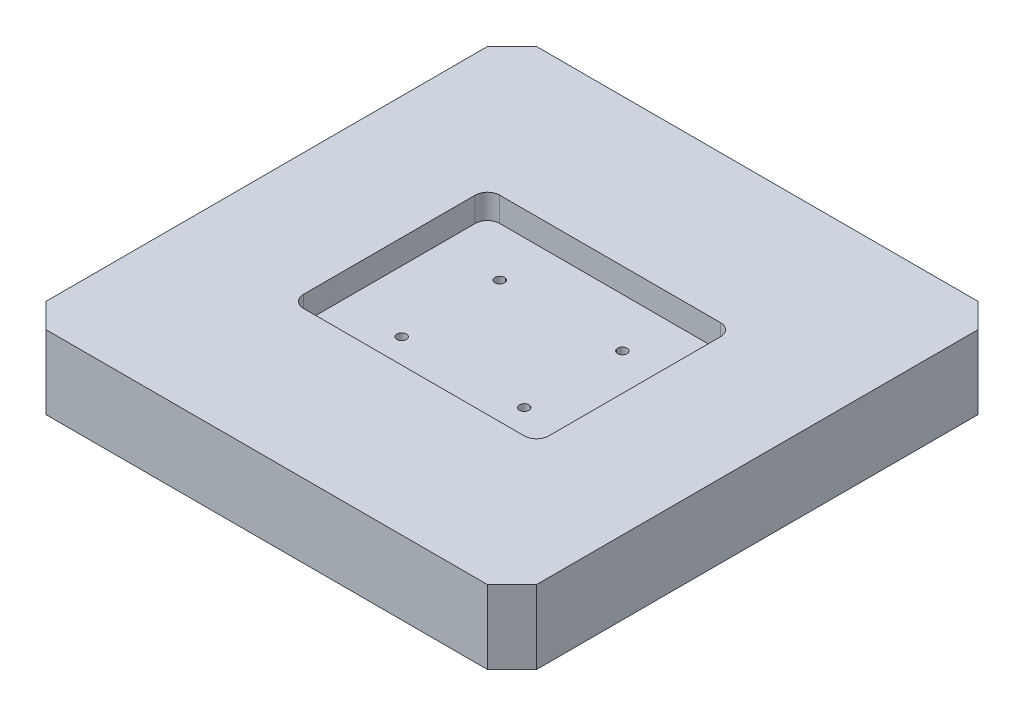
ISO-10303-21;
HEADER;
FILE_DESCRIPTION(('STEP AP214'),'2;1');
FILE_NAME('part.step','',(''),(''),'','','');
FILE_SCHEMA(('AUTOMOTIVE_DESIGN { 1 0 10303 214 1 1 1 1 }'));
ENDSEC;
DATA;
#1=APPLICATION_CONTEXT('core data for automotive mechanical design processes');
#2=APPLICATION_PROTOCOL_DEFINITION('international standard','automotive_design',2000,#1);
#3=PRODUCT_CONTEXT('',#1,'mechanical');
#4=PRODUCT('Part','Part','',(#3));
#5=PRODUCT_RELATED_PRODUCT_CATEGORY('part','',(#4));
#6=PRODUCT_DEFINITION_FORMATION('','',#4);
#7=PRODUCT_DEFINITION_CONTEXT('part definition',#1,'design');
#8=PRODUCT_DEFINITION('design','',#6,#7);
#9=PRODUCT_DEFINITION_SHAPE('','',#8);
#10=(LENGTH_UNIT() NAMED_UNIT(*) SI_UNIT(.MILLI.,.METRE.));
#11=(NAMED_UNIT(*) PLANE_ANGLE_UNIT() SI_UNIT($,.RADIAN.));
#12=(NAMED_UNIT(*) SI_UNIT($,.STERADIAN.) SOLID_ANGLE_UNIT());
#13=UNCERTAINTY_MEASURE_WITH_UNIT(LENGTH_MEASURE(1.E-05),#10,'distance_accuracy_value','');
#14=(GEOMETRIC_REPRESENTATION_CONTEXT(3) GLOBAL_UNCERTAINTY_ASSIGNED_CONTEXT((#13)) GLOBAL_UNIT_ASSIGNED_CONTEXT((#10,
#11,#12)) REPRESENTATION_CONTEXT('',''));
#15=CARTESIAN_POINT('',(0.,0.,0.));
#16=DIRECTION('',(0.,0.,1.));
#17=DIRECTION('',(1.,0.,0.));
#18=AXIS2_PLACEMENT_3D('',#15,#16,#17);
#19=CARTESIAN_POINT('',(0.,38.1,0.));
#20=DIRECTION('',(0.,1.,0.));
#21=DIRECTION('',(0.,0.,1.));
#22=AXIS2_PLACEMENT_3D('',#19,#20,#21);
#23=PLANE('',#22);
#24=DIRECTION('',(0.,0.,-1.));
#25=VECTOR('',#24,1.);
#26=CARTESIAN_POINT('',(254.,38.1,0.));
#27=LINE('',#26,#25);
#28=CARTESIAN_POINT('',(254.,38.1,-12.6999999999999));
#29=VERTEX_POINT('',#28);
#30=CARTESIAN_POINT('',(254.,38.1,-241.3));
#31=VERTEX_POINT('',#30);
#32=EDGE_CURVE('E202',#29,#31,#27,.T.);
#33=ORIENTED_EDGE('',*,*,#32,.T.);
#34=DIRECTION('',(-0.707106781186546,0.,-0.707106781186549));
#35=VECTOR('',#34,1.);
#36=CARTESIAN_POINT('',(247.650000000001,38.1,-247.649999999999));
#37=LINE('',#36,#35);
#38=CARTESIAN_POINT('',(241.3,38.1,-254.));
#39=VERTEX_POINT('',#38);
#40=EDGE_CURVE('E254',#31,#39,#37,.T.);
#41=ORIENTED_EDGE('',*,*,#40,.T.);
#42=DIRECTION('',(1.,0.,0.));
#43=VECTOR('',#42,1.);
#44=CARTESIAN_POINT('',(0.,38.1,-254.));
#45=LINE('',#44,#43);
#46=CARTESIAN_POINT('',(12.7000000000001,38.1,-254.));
#47=VERTEX_POINT('',#46);
#48=EDGE_CURVE('E199',#47,#39,#45,.T.);
#49=ORIENTED_EDGE('',*,*,#48,.F.);
#50=DIRECTION('',(0.707106781186549,0.,-0.707106781186546));
#51=VECTOR('',#50,1.);
#52=CARTESIAN_POINT('',(-120.65,38.1,-120.65));
#53=LINE('',#52,#51);
#54=CARTESIAN_POINT('',(0.,38.1,-241.3));
#55=VERTEX_POINT('',#54);
#56=EDGE_CURVE('E249',#47,#55,#53,.F.);
#57=ORIENTED_EDGE('',*,*,#56,.T.);
#58=DIRECTION('',(0.,0.,-1.));
#59=VECTOR('',#58,1.);
#60=CARTESIAN_POINT('',(0.,38.1,0.));
#61=LINE('',#60,#59);
#62=CARTESIAN_POINT('',(0.,38.1,-12.6999999999999));
#63=VERTEX_POINT('',#62);
#64=EDGE_CURVE('E208',#63,#55,#61,.T.);
#65=ORIENTED_EDGE('',*,*,#64,.F.);
#66=DIRECTION('',(0.707106781186548,0.,0.707106781186548));
#67=VECTOR('',#66,1.);
#68=CARTESIAN_POINT('',(6.34999999999996,38.1,-6.34999999999996));
#69=LINE('',#68,#67);
#70=CARTESIAN_POINT('',(12.6999999999999,38.1,0.));
#71=VERTEX_POINT('',#70);
#72=EDGE_CURVE('E73',#63,#71,#69,.T.);
#73=ORIENTED_EDGE('',*,*,#72,.T.);
#74=DIRECTION('',(1.,0.,0.));
#75=VECTOR('',#74,1.);
#76=CARTESIAN_POINT('',(0.,38.1,0.));
#77=LINE('',#76,#75);
#78=CARTESIAN_POINT('',(241.3,38.1,0.));
#79=VERTEX_POINT('',#78);
#80=EDGE_CURVE('E206',#71,#79,#77,.T.);
#81=ORIENTED_EDGE('',*,*,#80,.T.);
#82=DIRECTION('',(-0.707106781186548,0.,0.707106781186547));
#83=VECTOR('',#82,1.);
#84=CARTESIAN_POINT('',(120.65,38.1,120.65));
#85=LINE('',#84,#83);
#86=EDGE_CURVE('E252',#79,#29,#85,.F.);
#87=ORIENTED_EDGE('',*,*,#86,.T.);
#88=EDGE_LOOP('',(#33,#41,#49,#57,#65,#73,#81,#87));
#89=FACE_BOUND('',#88,.T.);
#90=DIRECTION('',(1.,0.,0.));
#91=VECTOR('',#90,1.);
#92=CARTESIAN_POINT('',(69.85,38.1,-76.2));
#93=LINE('',#92,#91);
#94=CARTESIAN_POINT('',(69.85,38.1,-76.2));
#95=VERTEX_POINT('',#94);
#96=CARTESIAN_POINT('',(184.15,38.1,-76.2));
#97=VERTEX_POINT('',#96);
#98=EDGE_CURVE('E184',#95,#97,#93,.T.);
#99=ORIENTED_EDGE('',*,*,#98,.F.);
#100=CARTESIAN_POINT('',(69.85,38.1,-82.55));
#101=DIRECTION('',(0.,-1.,0.));
#102=DIRECTION('',(0.,0.,-1.));
#103=AXIS2_PLACEMENT_3D('',#100,#101,#102);
#104=CIRCLE('',#103,6.34999999999999);
#105=CARTESIAN_POINT('',(63.5,38.1,-82.55));
#106=VERTEX_POINT('',#105);
#107=EDGE_CURVE('E231',#95,#106,#104,.T.);
#108=ORIENTED_EDGE('',*,*,#107,.T.);
#109=DIRECTION('',(0.,0.,-1.));
#110=VECTOR('',#109,1.);
#111=CARTESIAN_POINT('',(63.5,38.1,-82.55));
#112=LINE('',#111,#110);
#113=CARTESIAN_POINT('',(63.5,38.1,-171.45));
#114=VERTEX_POINT('',#113);
#115=EDGE_CURVE('E188',#106,#114,#112,.T.);
#116=ORIENTED_EDGE('',*,*,#115,.T.);
#117=CARTESIAN_POINT('',(69.85,38.1,-171.45));
#118=DIRECTION('',(0.,-1.,0.));
#119=DIRECTION('',(0.,0.,-1.));
#120=AXIS2_PLACEMENT_3D('',#117,#118,#119);
#121=CIRCLE('',#120,6.34999999999999);
#122=CARTESIAN_POINT('',(69.85,38.1,-177.8));
#123=VERTEX_POINT('',#122);
#124=EDGE_CURVE('E499',#114,#123,#121,.T.);
#125=ORIENTED_EDGE('',*,*,#124,.T.);
#126=DIRECTION('',(1.,0.,0.));
#127=VECTOR('',#126,1.);
#128=CARTESIAN_POINT('',(69.85,38.1,-177.8));
#129=LINE('',#128,#127);
#130=CARTESIAN_POINT('',(184.15,38.1,-177.8));
#131=VERTEX_POINT('',#130);
#132=EDGE_CURVE('E503',#123,#131,#129,.T.);
#133=ORIENTED_EDGE('',*,*,#132,.T.);
#134=CARTESIAN_POINT('',(184.15,38.1,-171.45));
#135=DIRECTION('',(0.,-1.,0.));
#136=DIRECTION('',(0.,0.,-1.));
#137=AXIS2_PLACEMENT_3D('',#134,#135,#136);
#138=CIRCLE('',#137,6.34999999999999);
#139=CARTESIAN_POINT('',(190.5,38.1,-171.45));
#140=VERTEX_POINT('',#139);
#141=EDGE_CURVE('E511',#131,#140,#138,.T.);
#142=ORIENTED_EDGE('',*,*,#141,.T.);
#143=DIRECTION('',(0.,0.,-1.));
#144=VECTOR('',#143,1.);
#145=CARTESIAN_POINT('',(190.5,38.1,-82.55));
#146=LINE('',#145,#144);
#147=CARTESIAN_POINT('',(190.5,38.1,-82.55));
#148=VERTEX_POINT('',#147);
#149=EDGE_CURVE('E514',#148,#140,#146,.T.);
#150=ORIENTED_EDGE('',*,*,#149,.F.);
#151=CARTESIAN_POINT('',(184.15,38.1,-82.55));
#152=DIRECTION('',(0.,1.,0.));
#153=DIRECTION('',(0.,0.,1.));
#154=AXIS2_PLACEMENT_3D('',#151,#152,#153);
#155=CIRCLE('',#154,6.34999999999999);
#156=EDGE_CURVE('E517',#97,#148,#155,.T.);
#157=ORIENTED_EDGE('',*,*,#156,.F.);
#158=EDGE_LOOP('',(#99,#108,#116,#125,#133,#142,#150,#157));
#159=FACE_BOUND('',#158,.T.);
#160=ADVANCED_FACE('F51',(#89,#159),#23,.T.);
#161=CARTESIAN_POINT('',(0.,38.1,-254.));
#162=DIRECTION('',(0.,0.,-1.));
#163=DIRECTION('',(-1.,0.,0.));
#164=AXIS2_PLACEMENT_3D('',#161,#162,#163);
#165=PLANE('',#164);
#166=ORIENTED_EDGE('',*,*,#48,.T.);
#167=DIRECTION('',(0.,-1.,0.));
#168=VECTOR('',#167,1.);
#169=CARTESIAN_POINT('',(241.3,0.,-254.));
#170=LINE('',#169,#168);
#171=CARTESIAN_POINT('',(241.3,0.,-254.));
#172=VERTEX_POINT('',#171);
#173=EDGE_CURVE('E233',#39,#172,#170,.T.);
#174=ORIENTED_EDGE('',*,*,#173,.T.);
#175=DIRECTION('',(1.,0.,0.));
#176=VECTOR('',#175,1.);
#177=CARTESIAN_POINT('',(0.,0.,-254.));
#178=LINE('',#177,#176);
#179=CARTESIAN_POINT('',(12.7000000000001,0.,-254.));
#180=VERTEX_POINT('',#179);
#181=EDGE_CURVE('E189',#180,#172,#178,.T.);
#182=ORIENTED_EDGE('',*,*,#181,.F.);
#183=DIRECTION('',(0.,1.,0.));
#184=VECTOR('',#183,1.);
#185=CARTESIAN_POINT('',(12.7000000000001,38.1,-254.));
#186=LINE('',#185,#184);
#187=EDGE_CURVE('E210',#180,#47,#186,.T.);
#188=ORIENTED_EDGE('',*,*,#187,.T.);
#189=EDGE_LOOP('',(#166,#174,#182,#188));
#190=FACE_BOUND('',#189,.T.);
#191=ADVANCED_FACE('F290',(#190),#165,.T.);
#192=CARTESIAN_POINT('',(0.,38.1,0.));
#193=DIRECTION('',(-1.,0.,0.));
#194=DIRECTION('',(0.,0.,1.));
#195=AXIS2_PLACEMENT_3D('',#192,#193,#194);
#196=PLANE('',#195);
#197=DIRECTION('',(0.,0.,-1.));
#198=VECTOR('',#197,1.);
#199=CARTESIAN_POINT('',(0.,0.,0.));
#200=LINE('',#199,#198);
#201=CARTESIAN_POINT('',(0.,0.,-12.6999999999999));
#202=VERTEX_POINT('',#201);
#203=CARTESIAN_POINT('',(0.,0.,-241.3));
#204=VERTEX_POINT('',#203);
#205=EDGE_CURVE('E203',#202,#204,#200,.T.);
#206=ORIENTED_EDGE('',*,*,#205,.F.);
#207=DIRECTION('',(0.,1.,0.));
#208=VECTOR('',#207,1.);
#209=CARTESIAN_POINT('',(0.,38.1,-12.6999999999999));
#210=LINE('',#209,#208);
#211=EDGE_CURVE('E13',#202,#63,#210,.T.);
#212=ORIENTED_EDGE('',*,*,#211,.T.);
#213=ORIENTED_EDGE('',*,*,#64,.T.);
#214=DIRECTION('',(0.,-1.,0.));
#215=VECTOR('',#214,1.);
#216=CARTESIAN_POINT('',(0.,38.1,-241.3));
#217=LINE('',#216,#215);
#218=EDGE_CURVE('E59',#55,#204,#217,.T.);
#219=ORIENTED_EDGE('',*,*,#218,.T.);
#220=EDGE_LOOP('',(#206,#212,#213,#219));
#221=FACE_BOUND('',#220,.T.);
#222=ADVANCED_FACE('F263',(#221),#196,.T.);
#223=CARTESIAN_POINT('',(0.,38.1,0.));
#224=DIRECTION('',(0.,0.,-1.));
#225=DIRECTION('',(-1.,0.,0.));
#226=AXIS2_PLACEMENT_3D('',#223,#224,#225);
#227=PLANE('',#226);
#228=DIRECTION('',(1.,0.,0.));
#229=VECTOR('',#228,1.);
#230=CARTESIAN_POINT('',(0.,0.,0.));
#231=LINE('',#230,#229);
#232=CARTESIAN_POINT('',(12.6999999999999,0.,0.));
#233=VERTEX_POINT('',#232);
#234=CARTESIAN_POINT('',(241.3,0.,0.));
#235=VERTEX_POINT('',#234);
#236=EDGE_CURVE('E214',#233,#235,#231,.T.);
#237=ORIENTED_EDGE('',*,*,#236,.T.);
#238=DIRECTION('',(0.,1.,0.));
#239=VECTOR('',#238,1.);
#240=CARTESIAN_POINT('',(241.3,38.1,0.));
#241=LINE('',#240,#239);
#242=EDGE_CURVE('E66',#235,#79,#241,.T.);
#243=ORIENTED_EDGE('',*,*,#242,.T.);
#244=ORIENTED_EDGE('',*,*,#80,.F.);
#245=DIRECTION('',(0.,-1.,0.));
#246=VECTOR('',#245,1.);
#247=CARTESIAN_POINT('',(12.6999999999999,0.,0.));
#248=LINE('',#247,#246);
#249=EDGE_CURVE('E256',#71,#233,#248,.T.);
#250=ORIENTED_EDGE('',*,*,#249,.T.);
#251=EDGE_LOOP('',(#237,#243,#244,#250));
#252=FACE_BOUND('',#251,.T.);
#253=ADVANCED_FACE('F274',(#252),#227,.F.);
#254=CARTESIAN_POINT('',(254.,38.1,0.));
#255=DIRECTION('',(-1.,0.,0.));
#256=DIRECTION('',(0.,0.,1.));
#257=AXIS2_PLACEMENT_3D('',#254,#255,#256);
#258=PLANE('',#257);
#259=DIRECTION('',(0.,0.,-1.));
#260=VECTOR('',#259,1.);
#261=CARTESIAN_POINT('',(254.,0.,0.));
#262=LINE('',#261,#260);
#263=CARTESIAN_POINT('',(254.,0.,-12.6999999999999));
#264=VERTEX_POINT('',#263);
#265=CARTESIAN_POINT('',(254.,0.,-241.3));
#266=VERTEX_POINT('',#265);
#267=EDGE_CURVE('E193',#264,#266,#262,.T.);
#268=ORIENTED_EDGE('',*,*,#267,.T.);
#269=DIRECTION('',(0.,1.,0.));
#270=VECTOR('',#269,1.);
#271=CARTESIAN_POINT('',(254.,38.1,-241.3));
#272=LINE('',#271,#270);
#273=EDGE_CURVE('E247',#266,#31,#272,.T.);
#274=ORIENTED_EDGE('',*,*,#273,.T.);
#275=ORIENTED_EDGE('',*,*,#32,.F.);
#276=DIRECTION('',(0.,-1.,0.));
#277=VECTOR('',#276,1.);
#278=CARTESIAN_POINT('',(254.,38.1,-12.6999999999999));
#279=LINE('',#278,#277);
#280=EDGE_CURVE('E244',#29,#264,#279,.T.);
#281=ORIENTED_EDGE('',*,*,#280,.T.);
#282=EDGE_LOOP('',(#268,#274,#275,#281));
#283=FACE_BOUND('',#282,.T.);
#284=ADVANCED_FACE('F283',(#283),#258,.F.);
#285=CARTESIAN_POINT('',(0.,0.,0.));
#286=DIRECTION('',(0.,1.,0.));
#287=DIRECTION('',(0.,0.,1.));
#288=AXIS2_PLACEMENT_3D('',#285,#286,#287);
#289=PLANE('',#288);
#290=CARTESIAN_POINT('',(95.25,0.,-101.6));
#291=DIRECTION('',(0.,1.,0.));
#292=DIRECTION('',(0.,0.,1.));
#293=AXIS2_PLACEMENT_3D('',#290,#291,#292);
#294=CIRCLE('',#293,2.4638);
#295=CARTESIAN_POINT('',(95.25,0.,-99.1362));
#296=VERTEX_POINT('',#295);
#297=EDGE_CURVE('E554',#296,#296,#294,.T.);
#298=ORIENTED_EDGE('',*,*,#297,.T.);
#299=EDGE_LOOP('',(#298));
#300=FACE_BOUND('',#299,.T.);
#301=CARTESIAN_POINT('',(158.75,0.,-101.6));
#302=DIRECTION('',(0.,1.,0.));
#303=DIRECTION('',(0.,0.,1.));
#304=AXIS2_PLACEMENT_3D('',#301,#302,#303);
#305=CIRCLE('',#304,2.46380000000003);
#306=CARTESIAN_POINT('',(158.75,0.,-99.1362));
#307=VERTEX_POINT('',#306);
#308=EDGE_CURVE('E557',#307,#307,#305,.T.);
#309=ORIENTED_EDGE('',*,*,#308,.T.);
#310=EDGE_LOOP('',(#309));
#311=FACE_BOUND('',#310,.T.);
#312=CARTESIAN_POINT('',(158.75,0.,-152.4));
#313=DIRECTION('',(0.,1.,0.));
#314=DIRECTION('',(0.,0.,1.));
#315=AXIS2_PLACEMENT_3D('',#312,#313,#314);
#316=CIRCLE('',#315,2.46380000000003);
#317=CARTESIAN_POINT('',(158.75,0.,-149.9362));
#318=VERTEX_POINT('',#317);
#319=EDGE_CURVE('E553',#318,#318,#316,.T.);
#320=ORIENTED_EDGE('',*,*,#319,.T.);
#321=EDGE_LOOP('',(#320));
#322=FACE_BOUND('',#321,.T.);
#323=CARTESIAN_POINT('',(95.25,0.,-152.4));
#324=DIRECTION('',(0.,1.,0.));
#325=DIRECTION('',(0.,0.,1.));
#326=AXIS2_PLACEMENT_3D('',#323,#324,#325);
#327=CIRCLE('',#326,2.4638);
#328=CARTESIAN_POINT('',(95.25,0.,-149.9362));
#329=VERTEX_POINT('',#328);
#330=EDGE_CURVE('E222',#329,#329,#327,.T.);
#331=ORIENTED_EDGE('',*,*,#330,.T.);
#332=EDGE_LOOP('',(#331));
#333=FACE_BOUND('',#332,.T.);
#334=ORIENTED_EDGE('',*,*,#181,.T.);
#335=DIRECTION('',(0.707106781186546,0.,0.707106781186549));
#336=VECTOR('',#335,1.);
#337=CARTESIAN_POINT('',(241.3,0.,-254.));
#338=LINE('',#337,#336);
#339=EDGE_CURVE('E242',#172,#266,#338,.T.);
#340=ORIENTED_EDGE('',*,*,#339,.T.);
#341=ORIENTED_EDGE('',*,*,#267,.F.);
#342=DIRECTION('',(0.707106781186548,0.,-0.707106781186547));
#343=VECTOR('',#342,1.);
#344=CARTESIAN_POINT('',(254.,0.,-12.6999999999999));
#345=LINE('',#344,#343);
#346=EDGE_CURVE('E240',#264,#235,#345,.F.);
#347=ORIENTED_EDGE('',*,*,#346,.T.);
#348=ORIENTED_EDGE('',*,*,#236,.F.);
#349=DIRECTION('',(-0.707106781186548,0.,-0.707106781186548));
#350=VECTOR('',#349,1.);
#351=CARTESIAN_POINT('',(12.6999999999999,0.,0.));
#352=LINE('',#351,#350);
#353=EDGE_CURVE('E238',#233,#202,#352,.T.);
#354=ORIENTED_EDGE('',*,*,#353,.T.);
#355=ORIENTED_EDGE('',*,*,#205,.T.);
#356=DIRECTION('',(-0.707106781186549,0.,0.707106781186546));
#357=VECTOR('',#356,1.);
#358=CARTESIAN_POINT('',(0.,0.,-241.3));
#359=LINE('',#358,#357);
#360=EDGE_CURVE('E236',#204,#180,#359,.F.);
#361=ORIENTED_EDGE('',*,*,#360,.T.);
#362=EDGE_LOOP('',(#334,#340,#341,#347,#348,#354,#355,#361));
#363=FACE_BOUND('',#362,.T.);
#364=ADVANCED_FACE('F268',(#300,#311,#322,#333,#363),#289,.F.);
#365=CARTESIAN_POINT('',(69.85,25.4,-82.55));
#366=DIRECTION('',(0.,1.,0.));
#367=DIRECTION('',(0.,0.,1.));
#368=AXIS2_PLACEMENT_3D('',#365,#366,#367);
#369=CYLINDRICAL_SURFACE('',#368,6.34999999999999);
#370=ORIENTED_EDGE('',*,*,#107,.F.);
#371=DIRECTION('',(0.,1.,0.));
#372=VECTOR('',#371,1.);
#373=CARTESIAN_POINT('',(69.85,25.4,-76.2));
#374=LINE('',#373,#372);
#375=CARTESIAN_POINT('',(69.85,25.4,-76.2));
#376=VERTEX_POINT('',#375);
#377=EDGE_CURVE('E183',#376,#95,#374,.T.);
#378=ORIENTED_EDGE('',*,*,#377,.F.);
#379=CARTESIAN_POINT('',(69.85,25.4,-82.55));
#380=DIRECTION('',(0.,-1.,0.));
#381=DIRECTION('',(0.,0.,-1.));
#382=AXIS2_PLACEMENT_3D('',#379,#380,#381);
#383=CIRCLE('',#382,6.34999999999999);
#384=CARTESIAN_POINT('',(63.5,25.4,-82.55));
#385=VERTEX_POINT('',#384);
#386=EDGE_CURVE('E169',#376,#385,#383,.T.);
#387=ORIENTED_EDGE('',*,*,#386,.T.);
#388=DIRECTION('',(0.,1.,0.));
#389=VECTOR('',#388,1.);
#390=CARTESIAN_POINT('',(63.5,25.4,-82.55));
#391=LINE('',#390,#389);
#392=EDGE_CURVE('E180',#385,#106,#391,.T.);
#393=ORIENTED_EDGE('',*,*,#392,.T.);
#394=EDGE_LOOP('',(#370,#378,#387,#393));
#395=FACE_BOUND('',#394,.T.);
#396=ADVANCED_FACE('F179',(#395),#369,.F.);
#397=CARTESIAN_POINT('',(63.5,25.4,-82.55));
#398=DIRECTION('',(1.,0.,0.));
#399=DIRECTION('',(0.,0.,-1.));
#400=AXIS2_PLACEMENT_3D('',#397,#398,#399);
#401=PLANE('',#400);
#402=ORIENTED_EDGE('',*,*,#115,.F.);
#403=ORIENTED_EDGE('',*,*,#392,.F.);
#404=DIRECTION('',(0.,0.,-1.));
#405=VECTOR('',#404,1.);
#406=CARTESIAN_POINT('',(63.5,25.4,-82.55));
#407=LINE('',#406,#405);
#408=CARTESIAN_POINT('',(63.5,25.4,-171.45));
#409=VERTEX_POINT('',#408);
#410=EDGE_CURVE('E165',#385,#409,#407,.T.);
#411=ORIENTED_EDGE('',*,*,#410,.T.);
#412=DIRECTION('',(0.,1.,0.));
#413=VECTOR('',#412,1.);
#414=CARTESIAN_POINT('',(63.5,25.4,-171.45));
#415=LINE('',#414,#413);
#416=EDGE_CURVE('E190',#409,#114,#415,.T.);
#417=ORIENTED_EDGE('',*,*,#416,.T.);
#418=EDGE_LOOP('',(#402,#403,#411,#417));
#419=FACE_BOUND('',#418,.T.);
#420=ADVANCED_FACE('F186',(#419),#401,.T.);
#421=CARTESIAN_POINT('',(69.85,25.4,-171.45));
#422=DIRECTION('',(0.,1.,0.));
#423=DIRECTION('',(0.,0.,1.));
#424=AXIS2_PLACEMENT_3D('',#421,#422,#423);
#425=CYLINDRICAL_SURFACE('',#424,6.34999999999999);
#426=ORIENTED_EDGE('',*,*,#124,.F.);
#427=ORIENTED_EDGE('',*,*,#416,.F.);
#428=CARTESIAN_POINT('',(69.85,25.4,-171.45));
#429=DIRECTION('',(0.,-1.,0.));
#430=DIRECTION('',(0.,0.,-1.));
#431=AXIS2_PLACEMENT_3D('',#428,#429,#430);
#432=CIRCLE('',#431,6.34999999999999);
#433=CARTESIAN_POINT('',(69.85,25.4,-177.8));
#434=VERTEX_POINT('',#433);
#435=EDGE_CURVE('E172',#409,#434,#432,.T.);
#436=ORIENTED_EDGE('',*,*,#435,.T.);
#437=DIRECTION('',(0.,1.,0.));
#438=VECTOR('',#437,1.);
#439=CARTESIAN_POINT('',(69.85,25.4,-177.8));
#440=LINE('',#439,#438);
#441=EDGE_CURVE('E195',#434,#123,#440,.T.);
#442=ORIENTED_EDGE('',*,*,#441,.T.);
#443=EDGE_LOOP('',(#426,#427,#436,#442));
#444=FACE_BOUND('',#443,.T.);
#445=ADVANCED_FACE('F428',(#444),#425,.F.);
#446=CARTESIAN_POINT('',(69.85,25.4,-177.8));
#447=DIRECTION('',(0.,0.,1.));
#448=DIRECTION('',(1.,0.,0.));
#449=AXIS2_PLACEMENT_3D('',#446,#447,#448);
#450=PLANE('',#449);
#451=ORIENTED_EDGE('',*,*,#132,.F.);
#452=ORIENTED_EDGE('',*,*,#441,.F.);
#453=DIRECTION('',(1.,0.,0.));
#454=VECTOR('',#453,1.);
#455=CARTESIAN_POINT('',(69.85,25.4,-177.8));
#456=LINE('',#455,#454);
#457=CARTESIAN_POINT('',(184.15,25.4,-177.8));
#458=VERTEX_POINT('',#457);
#459=EDGE_CURVE('E533',#434,#458,#456,.T.);
#460=ORIENTED_EDGE('',*,*,#459,.T.);
#461=DIRECTION('',(0.,1.,0.));
#462=VECTOR('',#461,1.);
#463=CARTESIAN_POINT('',(184.15,25.4,-177.8));
#464=LINE('',#463,#462);
#465=EDGE_CURVE('E530',#458,#131,#464,.T.);
#466=ORIENTED_EDGE('',*,*,#465,.T.);
#467=EDGE_LOOP('',(#451,#452,#460,#466));
#468=FACE_BOUND('',#467,.T.);
#469=ADVANCED_FACE('F419',(#468),#450,.T.);
#470=CARTESIAN_POINT('',(184.15,25.4,-171.45));
#471=DIRECTION('',(0.,1.,0.));
#472=DIRECTION('',(0.,0.,1.));
#473=AXIS2_PLACEMENT_3D('',#470,#471,#472);
#474=CYLINDRICAL_SURFACE('',#473,6.34999999999999);
#475=ORIENTED_EDGE('',*,*,#141,.F.);
#476=ORIENTED_EDGE('',*,*,#465,.F.);
#477=CARTESIAN_POINT('',(184.15,25.4,-171.45));
#478=DIRECTION('',(0.,-1.,0.));
#479=DIRECTION('',(0.,0.,-1.));
#480=AXIS2_PLACEMENT_3D('',#477,#478,#479);
#481=CIRCLE('',#480,6.34999999999999);
#482=CARTESIAN_POINT('',(190.5,25.4,-171.45));
#483=VERTEX_POINT('',#482);
#484=EDGE_CURVE('E547',#458,#483,#481,.T.);
#485=ORIENTED_EDGE('',*,*,#484,.T.);
#486=DIRECTION('',(0.,1.,0.));
#487=VECTOR('',#486,1.);
#488=CARTESIAN_POINT('',(190.5,25.4,-171.45));
#489=LINE('',#488,#487);
#490=EDGE_CURVE('E528',#483,#140,#489,.T.);
#491=ORIENTED_EDGE('',*,*,#490,.T.);
#492=EDGE_LOOP('',(#475,#476,#485,#491));
#493=FACE_BOUND('',#492,.T.);
#494=ADVANCED_FACE('F410',(#493),#474,.F.);
#495=CARTESIAN_POINT('',(190.5,25.4,-82.55));
#496=DIRECTION('',(1.,0.,0.));
#497=DIRECTION('',(0.,0.,-1.));
#498=AXIS2_PLACEMENT_3D('',#495,#496,#497);
#499=PLANE('',#498);
#500=ORIENTED_EDGE('',*,*,#149,.T.);
#501=ORIENTED_EDGE('',*,*,#490,.F.);
#502=DIRECTION('',(0.,0.,-1.));
#503=VECTOR('',#502,1.);
#504=CARTESIAN_POINT('',(190.5,25.4,-82.55));
#505=LINE('',#504,#503);
#506=CARTESIAN_POINT('',(190.5,25.4,-82.55));
#507=VERTEX_POINT('',#506);
#508=EDGE_CURVE('E540',#507,#483,#505,.T.);
#509=ORIENTED_EDGE('',*,*,#508,.F.);
#510=DIRECTION('',(0.,1.,0.));
#511=VECTOR('',#510,1.);
#512=CARTESIAN_POINT('',(190.5,25.4,-82.55));
#513=LINE('',#512,#511);
#514=EDGE_CURVE('E526',#507,#148,#513,.T.);
#515=ORIENTED_EDGE('',*,*,#514,.T.);
#516=EDGE_LOOP('',(#500,#501,#509,#515));
#517=FACE_BOUND('',#516,.T.);
#518=ADVANCED_FACE('F401',(#517),#499,.F.);
#519=CARTESIAN_POINT('',(184.15,25.4,-82.55));
#520=DIRECTION('',(0.,1.,0.));
#521=DIRECTION('',(0.,0.,1.));
#522=AXIS2_PLACEMENT_3D('',#519,#520,#521);
#523=CYLINDRICAL_SURFACE('',#522,6.34999999999999);
#524=ORIENTED_EDGE('',*,*,#156,.T.);
#525=ORIENTED_EDGE('',*,*,#514,.F.);
#526=CARTESIAN_POINT('',(184.15,25.4,-82.55));
#527=DIRECTION('',(0.,1.,0.));
#528=DIRECTION('',(0.,0.,1.));
#529=AXIS2_PLACEMENT_3D('',#526,#527,#528);
#530=CIRCLE('',#529,6.34999999999999);
#531=CARTESIAN_POINT('',(184.15,25.4,-76.2));
#532=VERTEX_POINT('',#531);
#533=EDGE_CURVE('E543',#532,#507,#530,.T.);
#534=ORIENTED_EDGE('',*,*,#533,.F.);
#535=DIRECTION('',(0.,1.,0.));
#536=VECTOR('',#535,1.);
#537=CARTESIAN_POINT('',(184.15,25.4,-76.2));
#538=LINE('',#537,#536);
#539=EDGE_CURVE('E523',#532,#97,#538,.T.);
#540=ORIENTED_EDGE('',*,*,#539,.T.);
#541=EDGE_LOOP('',(#524,#525,#534,#540));
#542=FACE_BOUND('',#541,.T.);
#543=ADVANCED_FACE('F392',(#542),#523,.F.);
#544=CARTESIAN_POINT('',(69.85,25.4,-76.2));
#545=DIRECTION('',(0.,0.,1.));
#546=DIRECTION('',(1.,0.,0.));
#547=AXIS2_PLACEMENT_3D('',#544,#545,#546);
#548=PLANE('',#547);
#549=ORIENTED_EDGE('',*,*,#98,.T.);
#550=ORIENTED_EDGE('',*,*,#539,.F.);
#551=DIRECTION('',(1.,0.,0.));
#552=VECTOR('',#551,1.);
#553=CARTESIAN_POINT('',(69.85,25.4,-76.2));
#554=LINE('',#553,#552);
#555=EDGE_CURVE('E524',#376,#532,#554,.T.);
#556=ORIENTED_EDGE('',*,*,#555,.F.);
#557=ORIENTED_EDGE('',*,*,#377,.T.);
#558=EDGE_LOOP('',(#549,#550,#556,#557));
#559=FACE_BOUND('',#558,.T.);
#560=ADVANCED_FACE('F383',(#559),#548,.F.);
#561=CARTESIAN_POINT('',(69.85,25.4,-82.55));
#562=DIRECTION('',(0.,-1.,0.));
#563=DIRECTION('',(0.,0.,-1.));
#564=AXIS2_PLACEMENT_3D('',#561,#562,#563);
#565=PLANE('',#564);
#566=CARTESIAN_POINT('',(95.25,25.4,-101.6));
#567=DIRECTION('',(0.,-1.,0.));
#568=DIRECTION('',(0.,0.,-1.));
#569=AXIS2_PLACEMENT_3D('',#566,#567,#568);
#570=CIRCLE('',#569,2.4638);
#571=CARTESIAN_POINT('',(95.25,25.4,-99.1362));
#572=VERTEX_POINT('',#571);
#573=EDGE_CURVE('E228',#572,#572,#570,.T.);
#574=ORIENTED_EDGE('',*,*,#573,.T.);
#575=EDGE_LOOP('',(#574));
#576=FACE_BOUND('',#575,.T.);
#577=CARTESIAN_POINT('',(158.75,25.4,-101.6));
#578=DIRECTION('',(0.,-1.,0.));
#579=DIRECTION('',(0.,0.,-1.));
#580=AXIS2_PLACEMENT_3D('',#577,#578,#579);
#581=CIRCLE('',#580,2.46380000000003);
#582=CARTESIAN_POINT('',(158.75,25.4,-99.1362));
#583=VERTEX_POINT('',#582);
#584=EDGE_CURVE('E225',#583,#583,#581,.T.);
#585=ORIENTED_EDGE('',*,*,#584,.T.);
#586=EDGE_LOOP('',(#585));
#587=FACE_BOUND('',#586,.T.);
#588=CARTESIAN_POINT('',(158.75,25.4,-152.4));
#589=DIRECTION('',(0.,-1.,0.));
#590=DIRECTION('',(0.,0.,-1.));
#591=AXIS2_PLACEMENT_3D('',#588,#589,#590);
#592=CIRCLE('',#591,2.46380000000003);
#593=CARTESIAN_POINT('',(158.75,25.4,-149.9362));
#594=VERTEX_POINT('',#593);
#595=EDGE_CURVE('E221',#594,#594,#592,.T.);
#596=ORIENTED_EDGE('',*,*,#595,.T.);
#597=EDGE_LOOP('',(#596));
#598=FACE_BOUND('',#597,.T.);
#599=CARTESIAN_POINT('',(95.25,25.4,-152.4));
#600=DIRECTION('',(0.,-1.,0.));
#601=DIRECTION('',(0.,0.,-1.));
#602=AXIS2_PLACEMENT_3D('',#599,#600,#601);
#603=CIRCLE('',#602,2.4638);
#604=CARTESIAN_POINT('',(95.25,25.4,-149.9362));
#605=VERTEX_POINT('',#604);
#606=EDGE_CURVE('E218',#605,#605,#603,.T.);
#607=ORIENTED_EDGE('',*,*,#606,.T.);
#608=EDGE_LOOP('',(#607));
#609=FACE_BOUND('',#608,.T.);
#610=ORIENTED_EDGE('',*,*,#386,.F.);
#611=ORIENTED_EDGE('',*,*,#555,.T.);
#612=ORIENTED_EDGE('',*,*,#533,.T.);
#613=ORIENTED_EDGE('',*,*,#508,.T.);
#614=ORIENTED_EDGE('',*,*,#484,.F.);
#615=ORIENTED_EDGE('',*,*,#459,.F.);
#616=ORIENTED_EDGE('',*,*,#435,.F.);
#617=ORIENTED_EDGE('',*,*,#410,.F.);
#618=EDGE_LOOP('',(#610,#611,#612,#613,#614,#615,#616,#617));
#619=FACE_BOUND('',#618,.T.);
#620=ADVANCED_FACE('F167',(#576,#587,#598,#609,#619),#565,.F.);
#621=CARTESIAN_POINT('',(95.25,0.,-152.4));
#622=DIRECTION('',(0.,1.,0.));
#623=DIRECTION('',(0.,0.,1.));
#624=AXIS2_PLACEMENT_3D('',#621,#622,#623);
#625=CYLINDRICAL_SURFACE('',#624,2.4638);
#626=CARTESIAN_POINT('',(95.25,0.,-149.9362));
#627=CARTESIAN_POINT('',(95.25,0.264583333333333,-149.9362));
#628=CARTESIAN_POINT('',(95.25,0.529166666666667,-149.9362));
#629=CARTESIAN_POINT('',(95.25,1.05833333333333,-149.9362));
#630=CARTESIAN_POINT('',(95.25,1.32291666666667,-149.9362));
#631=CARTESIAN_POINT('',(95.25,1.85208333333333,-149.9362));
#632=CARTESIAN_POINT('',(95.25,2.11666666666667,-149.9362));
#633=CARTESIAN_POINT('',(95.25,2.64583333333333,-149.9362));
#634=CARTESIAN_POINT('',(95.25,2.91041666666667,-149.9362));
#635=CARTESIAN_POINT('',(95.25,3.43958333333333,-149.9362));
#636=CARTESIAN_POINT('',(95.25,3.70416666666667,-149.9362));
#637=CARTESIAN_POINT('',(95.25,4.23333333333333,-149.9362));
#638=CARTESIAN_POINT('',(95.25,4.49791666666667,-149.9362));
#639=CARTESIAN_POINT('',(95.25,5.02708333333333,-149.9362));
#640=CARTESIAN_POINT('',(95.25,5.29166666666667,-149.9362));
#641=CARTESIAN_POINT('',(95.25,5.82083333333333,-149.9362));
#642=CARTESIAN_POINT('',(95.25,6.08541666666667,-149.9362));
#643=CARTESIAN_POINT('',(95.25,6.61458333333333,-149.9362));
#644=CARTESIAN_POINT('',(95.25,6.87916666666667,-149.9362));
#645=CARTESIAN_POINT('',(95.25,7.40833333333333,-149.9362));
#646=CARTESIAN_POINT('',(95.25,7.67291666666667,-149.9362));
#647=CARTESIAN_POINT('',(95.25,8.20208333333333,-149.9362));
#648=CARTESIAN_POINT('',(95.25,8.46666666666667,-149.9362));
#649=CARTESIAN_POINT('',(95.25,8.99583333333334,-149.9362));
#650=CARTESIAN_POINT('',(95.25,9.26041666666667,-149.9362));
#651=CARTESIAN_POINT('',(95.25,9.78958333333333,-149.9362));
#652=CARTESIAN_POINT('',(95.25,10.0541666666667,-149.9362));
#653=CARTESIAN_POINT('',(95.25,10.5833333333333,-149.9362));
#654=CARTESIAN_POINT('',(95.25,10.8479166666667,-149.9362));
#655=CARTESIAN_POINT('',(95.25,11.3770833333333,-149.9362));
#656=CARTESIAN_POINT('',(95.25,11.6416666666667,-149.9362));
#657=CARTESIAN_POINT('',(95.25,12.1708333333333,-149.9362));
#658=CARTESIAN_POINT('',(95.25,12.4354166666667,-149.9362));
#659=CARTESIAN_POINT('',(95.25,12.9645833333333,-149.9362));
#660=CARTESIAN_POINT('',(95.25,13.2291666666667,-149.9362));
#661=CARTESIAN_POINT('',(95.25,13.7583333333333,-149.9362));
#662=CARTESIAN_POINT('',(95.25,14.0229166666667,-149.9362));
#663=CARTESIAN_POINT('',(95.25,14.5520833333333,-149.9362));
#664=CARTESIAN_POINT('',(95.25,14.8166666666667,-149.9362));
#665=CARTESIAN_POINT('',(95.25,15.3458333333333,-149.9362));
#666=CARTESIAN_POINT('',(95.25,15.6104166666667,-149.9362));
#667=CARTESIAN_POINT('',(95.25,16.1395833333333,-149.9362));
#668=CARTESIAN_POINT('',(95.25,16.4041666666667,-149.9362));
#669=CARTESIAN_POINT('',(95.25,16.9333333333333,-149.9362));
#670=CARTESIAN_POINT('',(95.25,17.1979166666667,-149.9362));
#671=CARTESIAN_POINT('',(95.25,17.7270833333333,-149.9362));
#672=CARTESIAN_POINT('',(95.25,17.9916666666667,-149.9362));
#673=CARTESIAN_POINT('',(95.25,18.5208333333333,-149.9362));
#674=CARTESIAN_POINT('',(95.25,18.7854166666667,-149.9362));
#675=CARTESIAN_POINT('',(95.25,19.3145833333333,-149.9362));
#676=CARTESIAN_POINT('',(95.25,19.5791666666667,-149.9362));
#677=CARTESIAN_POINT('',(95.25,20.1083333333333,-149.9362));
#678=CARTESIAN_POINT('',(95.25,20.3729166666667,-149.9362));
#679=CARTESIAN_POINT('',(95.25,20.9020833333333,-149.9362));
#680=CARTESIAN_POINT('',(95.25,21.1666666666667,-149.9362));
#681=CARTESIAN_POINT('',(95.25,21.6958333333333,-149.9362));
#682=CARTESIAN_POINT('',(95.25,21.9604166666667,-149.9362));
#683=CARTESIAN_POINT('',(95.25,22.4895833333333,-149.9362));
#684=CARTESIAN_POINT('',(95.25,22.7541666666667,-149.9362));
#685=CARTESIAN_POINT('',(95.25,23.2833333333333,-149.9362));
#686=CARTESIAN_POINT('',(95.25,23.5479166666667,-149.9362));
#687=CARTESIAN_POINT('',(95.25,24.0770833333333,-149.9362));
#688=CARTESIAN_POINT('',(95.25,24.3416666666667,-149.9362));
#689=CARTESIAN_POINT('',(95.25,24.8708333333333,-149.9362));
#690=CARTESIAN_POINT('',(95.25,25.1354166666667,-149.9362));
#691=CARTESIAN_POINT('',(95.25,25.4,-149.9362));
#692=B_SPLINE_CURVE_WITH_KNOTS('',3,(#626,#627,#628,#629,#630,#631,#632,#633,#634,#635,#636,
#637,#638,#639,#640,#641,#642,#643,#644,#645,#646,#647,#648,#649,#650,#651,#652,#653,#654,#655,
#656,#657,#658,#659,#660,#661,#662,#663,#664,#665,#666,#667,#668,#669,#670,#671,#672,#673,#674,
#675,#676,#677,#678,#679,#680,#681,#682,#683,#684,#685,#686,#687,#688,#689,#690,#691),
.UNSPECIFIED.,.F.,.F.,(4,2,2,2,2,2,2,2,2,2,2,2,2,2,2,2,2,2,2,2,2,2,2,2,2,2,2,2,2,2,2,2,4),(0.,
0.79375,1.5875,2.38125,3.175,3.96875,4.7625,5.55625,6.35,7.14375,7.9375,8.73125,9.525,10.31875,
11.1125,11.90625,12.7,13.49375,14.2875,15.08125,15.875,16.66875,17.4625,18.25625,19.05,19.84375,
20.6375,21.43125,22.225,23.01875,23.8125,24.60625,25.4),.UNSPECIFIED.);
#693=EDGE_CURVE('BSEAM366',#329,#605,#692,.T.);
#694=ORIENTED_EDGE('',*,*,#330,.F.);
#695=ORIENTED_EDGE('',*,*,#606,.F.);
#696=ORIENTED_EDGE('',*,*,#693,.T.);
#697=ORIENTED_EDGE('',*,*,#693,.F.);
#698=EDGE_LOOP('',(#694,#696,#695,#697));
#699=FACE_BOUND('',#698,.T.);
#700=ADVANCED_FACE('F366',(#699),#625,.F.);
#701=CARTESIAN_POINT('',(158.75,0.,-152.4));
#702=DIRECTION('',(0.,1.,0.));
#703=DIRECTION('',(0.,0.,1.));
#704=AXIS2_PLACEMENT_3D('',#701,#702,#703);
#705=CYLINDRICAL_SURFACE('',#704,2.46380000000003);
#706=CARTESIAN_POINT('',(158.75,0.,-149.9362));
#707=CARTESIAN_POINT('',(158.75,0.264583333333333,-149.9362));
#708=CARTESIAN_POINT('',(158.75,0.529166666666667,-149.9362));
#709=CARTESIAN_POINT('',(158.75,1.05833333333333,-149.9362));
#710=CARTESIAN_POINT('',(158.75,1.32291666666667,-149.9362));
#711=CARTESIAN_POINT('',(158.75,1.85208333333333,-149.9362));
#712=CARTESIAN_POINT('',(158.75,2.11666666666667,-149.9362));
#713=CARTESIAN_POINT('',(158.75,2.64583333333333,-149.9362));
#714=CARTESIAN_POINT('',(158.75,2.91041666666667,-149.9362));
#715=CARTESIAN_POINT('',(158.75,3.43958333333333,-149.9362));
#716=CARTESIAN_POINT('',(158.75,3.70416666666667,-149.9362));
#717=CARTESIAN_POINT('',(158.75,4.23333333333333,-149.9362));
#718=CARTESIAN_POINT('',(158.75,4.49791666666667,-149.9362));
#719=CARTESIAN_POINT('',(158.75,5.02708333333333,-149.9362));
#720=CARTESIAN_POINT('',(158.75,5.29166666666667,-149.9362));
#721=CARTESIAN_POINT('',(158.75,5.82083333333333,-149.9362));
#722=CARTESIAN_POINT('',(158.75,6.08541666666667,-149.9362));
#723=CARTESIAN_POINT('',(158.75,6.61458333333333,-149.9362));
#724=CARTESIAN_POINT('',(158.75,6.87916666666667,-149.9362));
#725=CARTESIAN_POINT('',(158.75,7.40833333333333,-149.9362));
#726=CARTESIAN_POINT('',(158.75,7.67291666666667,-149.9362));
#727=CARTESIAN_POINT('',(158.75,8.20208333333333,-149.9362));
#728=CARTESIAN_POINT('',(158.75,8.46666666666667,-149.9362));
#729=CARTESIAN_POINT('',(158.75,8.99583333333334,-149.9362));
#730=CARTESIAN_POINT('',(158.75,9.26041666666667,-149.9362));
#731=CARTESIAN_POINT('',(158.75,9.78958333333333,-149.9362));
#732=CARTESIAN_POINT('',(158.75,10.0541666666667,-149.9362));
#733=CARTESIAN_POINT('',(158.75,10.5833333333333,-149.9362));
#734=CARTESIAN_POINT('',(158.75,10.8479166666667,-149.9362));
#735=CARTESIAN_POINT('',(158.75,11.3770833333333,-149.9362));
#736=CARTESIAN_POINT('',(158.75,11.6416666666667,-149.9362));
#737=CARTESIAN_POINT('',(158.75,12.1708333333333,-149.9362));
#738=CARTESIAN_POINT('',(158.75,12.4354166666667,-149.9362));
#739=CARTESIAN_POINT('',(158.75,12.9645833333333,-149.9362));
#740=CARTESIAN_POINT('',(158.75,13.2291666666667,-149.9362));
#741=CARTESIAN_POINT('',(158.75,13.7583333333333,-149.9362));
#742=CARTESIAN_POINT('',(158.75,14.0229166666667,-149.9362));
#743=CARTESIAN_POINT('',(158.75,14.5520833333333,-149.9362));
#744=CARTESIAN_POINT('',(158.75,14.8166666666667,-149.9362));
#745=CARTESIAN_POINT('',(158.75,15.3458333333333,-149.9362));
#746=CARTESIAN_POINT('',(158.75,15.6104166666667,-149.9362));
#747=CARTESIAN_POINT('',(158.75,16.1395833333333,-149.9362));
#748=CARTESIAN_POINT('',(158.75,16.4041666666667,-149.9362));
#749=CARTESIAN_POINT('',(158.75,16.9333333333333,-149.9362));
#750=CARTESIAN_POINT('',(158.75,17.1979166666667,-149.9362));
#751=CARTESIAN_POINT('',(158.75,17.7270833333333,-149.9362));
#752=CARTESIAN_POINT('',(158.75,17.9916666666667,-149.9362));
#753=CARTESIAN_POINT('',(158.75,18.5208333333333,-149.9362));
#754=CARTESIAN_POINT('',(158.75,18.7854166666667,-149.9362));
#755=CARTESIAN_POINT('',(158.75,19.3145833333333,-149.9362));
#756=CARTESIAN_POINT('',(158.75,19.5791666666667,-149.9362));
#757=CARTESIAN_POINT('',(158.75,20.1083333333333,-149.9362));
#758=CARTESIAN_POINT('',(158.75,20.3729166666667,-149.9362));
#759=CARTESIAN_POINT('',(158.75,20.9020833333333,-149.9362));
#760=CARTESIAN_POINT('',(158.75,21.1666666666667,-149.9362));
#761=CARTESIAN_POINT('',(158.75,21.6958333333333,-149.9362));
#762=CARTESIAN_POINT('',(158.75,21.9604166666667,-149.9362));
#763=CARTESIAN_POINT('',(158.75,22.4895833333333,-149.9362));
#764=CARTESIAN_POINT('',(158.75,22.7541666666667,-149.9362));
#765=CARTESIAN_POINT('',(158.75,23.2833333333333,-149.9362));
#766=CARTESIAN_POINT('',(158.75,23.5479166666667,-149.9362));
#767=CARTESIAN_POINT('',(158.75,24.0770833333333,-149.9362));
#768=CARTESIAN_POINT('',(158.75,24.3416666666667,-149.9362));
#769=CARTESIAN_POINT('',(158.75,24.8708333333333,-149.9362));
#770=CARTESIAN_POINT('',(158.75,25.1354166666667,-149.9362));
#771=CARTESIAN_POINT('',(158.75,25.4,-149.9362));
#772=B_SPLINE_CURVE_WITH_KNOTS('',3,(#706,#707,#708,#709,#710,#711,#712,#713,#714,#715,#716,
#717,#718,#719,#720,#721,#722,#723,#724,#725,#726,#727,#728,#729,#730,#731,#732,#733,#734,#735,
#736,#737,#738,#739,#740,#741,#742,#743,#744,#745,#746,#747,#748,#749,#750,#751,#752,#753,#754,
#755,#756,#757,#758,#759,#760,#761,#762,#763,#764,#765,#766,#767,#768,#769,#770,#771),
.UNSPECIFIED.,.F.,.F.,(4,2,2,2,2,2,2,2,2,2,2,2,2,2,2,2,2,2,2,2,2,2,2,2,2,2,2,2,2,2,2,2,4),(0.,
0.79375,1.5875,2.38125,3.175,3.96875,4.7625,5.55625,6.35,7.14375,7.9375,8.73125,9.525,10.31875,
11.1125,11.90625,12.7,13.49375,14.2875,15.08125,15.875,16.66875,17.4625,18.25625,19.05,19.84375,
20.6375,21.43125,22.225,23.01875,23.8125,24.60625,25.4),.UNSPECIFIED.);
#773=EDGE_CURVE('BSEAM357',#318,#594,#772,.T.);
#774=ORIENTED_EDGE('',*,*,#319,.F.);
#775=ORIENTED_EDGE('',*,*,#595,.F.);
#776=ORIENTED_EDGE('',*,*,#773,.T.);
#777=ORIENTED_EDGE('',*,*,#773,.F.);
#778=EDGE_LOOP('',(#774,#776,#775,#777));
#779=FACE_BOUND('',#778,.T.);
#780=ADVANCED_FACE('F357',(#779),#705,.F.);
#781=CARTESIAN_POINT('',(158.75,0.,-101.6));
#782=DIRECTION('',(0.,1.,0.));
#783=DIRECTION('',(0.,0.,1.));
#784=AXIS2_PLACEMENT_3D('',#781,#782,#783);
#785=CYLINDRICAL_SURFACE('',#784,2.46380000000003);
#786=CARTESIAN_POINT('',(158.75,0.,-99.1362));
#787=CARTESIAN_POINT('',(158.75,0.264583333333333,-99.1362));
#788=CARTESIAN_POINT('',(158.75,0.529166666666667,-99.1362));
#789=CARTESIAN_POINT('',(158.75,1.05833333333333,-99.1362));
#790=CARTESIAN_POINT('',(158.75,1.32291666666667,-99.1362));
#791=CARTESIAN_POINT('',(158.75,1.85208333333333,-99.1362));
#792=CARTESIAN_POINT('',(158.75,2.11666666666667,-99.1362));
#793=CARTESIAN_POINT('',(158.75,2.64583333333333,-99.1362));
#794=CARTESIAN_POINT('',(158.75,2.91041666666667,-99.1362));
#795=CARTESIAN_POINT('',(158.75,3.43958333333333,-99.1362));
#796=CARTESIAN_POINT('',(158.75,3.70416666666667,-99.1362));
#797=CARTESIAN_POINT('',(158.75,4.23333333333333,-99.1362));
#798=CARTESIAN_POINT('',(158.75,4.49791666666667,-99.1362));
#799=CARTESIAN_POINT('',(158.75,5.02708333333333,-99.1362));
#800=CARTESIAN_POINT('',(158.75,5.29166666666667,-99.1362));
#801=CARTESIAN_POINT('',(158.75,5.82083333333333,-99.1362));
#802=CARTESIAN_POINT('',(158.75,6.08541666666667,-99.1362));
#803=CARTESIAN_POINT('',(158.75,6.61458333333333,-99.1362));
#804=CARTESIAN_POINT('',(158.75,6.87916666666667,-99.1362));
#805=CARTESIAN_POINT('',(158.75,7.40833333333333,-99.1362));
#806=CARTESIAN_POINT('',(158.75,7.67291666666667,-99.1362));
#807=CARTESIAN_POINT('',(158.75,8.20208333333333,-99.1362));
#808=CARTESIAN_POINT('',(158.75,8.46666666666667,-99.1362));
#809=CARTESIAN_POINT('',(158.75,8.99583333333334,-99.1362));
#810=CARTESIAN_POINT('',(158.75,9.26041666666667,-99.1362));
#811=CARTESIAN_POINT('',(158.75,9.78958333333333,-99.1362));
#812=CARTESIAN_POINT('',(158.75,10.0541666666667,-99.1362));
#813=CARTESIAN_POINT('',(158.75,10.5833333333333,-99.1362));
#814=CARTESIAN_POINT('',(158.75,10.8479166666667,-99.1362));
#815=CARTESIAN_POINT('',(158.75,11.3770833333333,-99.1362));
#816=CARTESIAN_POINT('',(158.75,11.6416666666667,-99.1362));
#817=CARTESIAN_POINT('',(158.75,12.1708333333333,-99.1362));
#818=CARTESIAN_POINT('',(158.75,12.4354166666667,-99.1362));
#819=CARTESIAN_POINT('',(158.75,12.9645833333333,-99.1362));
#820=CARTESIAN_POINT('',(158.75,13.2291666666667,-99.1362));
#821=CARTESIAN_POINT('',(158.75,13.7583333333333,-99.1362));
#822=CARTESIAN_POINT('',(158.75,14.0229166666667,-99.1362));
#823=CARTESIAN_POINT('',(158.75,14.5520833333333,-99.1362));
#824=CARTESIAN_POINT('',(158.75,14.8166666666667,-99.1362));
#825=CARTESIAN_POINT('',(158.75,15.3458333333333,-99.1362));
#826=CARTESIAN_POINT('',(158.75,15.6104166666667,-99.1362));
#827=CARTESIAN_POINT('',(158.75,16.1395833333333,-99.1362));
#828=CARTESIAN_POINT('',(158.75,16.4041666666667,-99.1362));
#829=CARTESIAN_POINT('',(158.75,16.9333333333333,-99.1362));
#830=CARTESIAN_POINT('',(158.75,17.1979166666667,-99.1362));
#831=CARTESIAN_POINT('',(158.75,17.7270833333333,-99.1362));
#832=CARTESIAN_POINT('',(158.75,17.9916666666667,-99.1362));
#833=CARTESIAN_POINT('',(158.75,18.5208333333333,-99.1362));
#834=CARTESIAN_POINT('',(158.75,18.7854166666667,-99.1362));
#835=CARTESIAN_POINT('',(158.75,19.3145833333333,-99.1362));
#836=CARTESIAN_POINT('',(158.75,19.5791666666667,-99.1362));
#837=CARTESIAN_POINT('',(158.75,20.1083333333333,-99.1362));
#838=CARTESIAN_POINT('',(158.75,20.3729166666667,-99.1362));
#839=CARTESIAN_POINT('',(158.75,20.9020833333333,-99.1362));
#840=CARTESIAN_POINT('',(158.75,21.1666666666667,-99.1362));
#841=CARTESIAN_POINT('',(158.75,21.6958333333333,-99.1362));
#842=CARTESIAN_POINT('',(158.75,21.9604166666667,-99.1362));
#843=CARTESIAN_POINT('',(158.75,22.4895833333333,-99.1362));
#844=CARTESIAN_POINT('',(158.75,22.7541666666667,-99.1362));
#845=CARTESIAN_POINT('',(158.75,23.2833333333333,-99.1362));
#846=CARTESIAN_POINT('',(158.75,23.5479166666667,-99.1362));
#847=CARTESIAN_POINT('',(158.75,24.0770833333333,-99.1362));
#848=CARTESIAN_POINT('',(158.75,24.3416666666667,-99.1362));
#849=CARTESIAN_POINT('',(158.75,24.8708333333333,-99.1362));
#850=CARTESIAN_POINT('',(158.75,25.1354166666667,-99.1362));
#851=CARTESIAN_POINT('',(158.75,25.4,-99.1362));
#852=B_SPLINE_CURVE_WITH_KNOTS('',3,(#786,#787,#788,#789,#790,#791,#792,#793,#794,#795,#796,
#797,#798,#799,#800,#801,#802,#803,#804,#805,#806,#807,#808,#809,#810,#811,#812,#813,#814,#815,
#816,#817,#818,#819,#820,#821,#822,#823,#824,#825,#826,#827,#828,#829,#830,#831,#832,#833,#834,
#835,#836,#837,#838,#839,#840,#841,#842,#843,#844,#845,#846,#847,#848,#849,#850,#851),
.UNSPECIFIED.,.F.,.F.,(4,2,2,2,2,2,2,2,2,2,2,2,2,2,2,2,2,2,2,2,2,2,2,2,2,2,2,2,2,2,2,2,4),(0.,
0.79375,1.5875,2.38125,3.175,3.96875,4.7625,5.55625,6.35,7.14375,7.9375,8.73125,9.525,10.31875,
11.1125,11.90625,12.7,13.49375,14.2875,15.08125,15.875,16.66875,17.4625,18.25625,19.05,19.84375,
20.6375,21.43125,22.225,23.01875,23.8125,24.60625,25.4),.UNSPECIFIED.);
#853=EDGE_CURVE('BSEAM348',#307,#583,#852,.T.);
#854=ORIENTED_EDGE('',*,*,#308,.F.);
#855=ORIENTED_EDGE('',*,*,#584,.F.);
#856=ORIENTED_EDGE('',*,*,#853,.T.);
#857=ORIENTED_EDGE('',*,*,#853,.F.);
#858=EDGE_LOOP('',(#854,#856,#855,#857));
#859=FACE_BOUND('',#858,.T.);
#860=ADVANCED_FACE('F348',(#859),#785,.F.);
#861=CARTESIAN_POINT('',(95.25,0.,-101.6));
#862=DIRECTION('',(0.,1.,0.));
#863=DIRECTION('',(0.,0.,1.));
#864=AXIS2_PLACEMENT_3D('',#861,#862,#863);
#865=CYLINDRICAL_SURFACE('',#864,2.4638);
#866=CARTESIAN_POINT('',(95.25,0.,-99.1362));
#867=CARTESIAN_POINT('',(95.25,0.264583333333333,-99.1362));
#868=CARTESIAN_POINT('',(95.25,0.529166666666667,-99.1362));
#869=CARTESIAN_POINT('',(95.25,1.05833333333333,-99.1362));
#870=CARTESIAN_POINT('',(95.25,1.32291666666667,-99.1362));
#871=CARTESIAN_POINT('',(95.25,1.85208333333333,-99.1362));
#872=CARTESIAN_POINT('',(95.25,2.11666666666667,-99.1362));
#873=CARTESIAN_POINT('',(95.25,2.64583333333333,-99.1362));
#874=CARTESIAN_POINT('',(95.25,2.91041666666667,-99.1362));
#875=CARTESIAN_POINT('',(95.25,3.43958333333333,-99.1362));
#876=CARTESIAN_POINT('',(95.25,3.70416666666667,-99.1362));
#877=CARTESIAN_POINT('',(95.25,4.23333333333333,-99.1362));
#878=CARTESIAN_POINT('',(95.25,4.49791666666667,-99.1362));
#879=CARTESIAN_POINT('',(95.25,5.02708333333333,-99.1362));
#880=CARTESIAN_POINT('',(95.25,5.29166666666667,-99.1362));
#881=CARTESIAN_POINT('',(95.25,5.82083333333333,-99.1362));
#882=CARTESIAN_POINT('',(95.25,6.08541666666667,-99.1362));
#883=CARTESIAN_POINT('',(95.25,6.61458333333333,-99.1362));
#884=CARTESIAN_POINT('',(95.25,6.87916666666667,-99.1362));
#885=CARTESIAN_POINT('',(95.25,7.40833333333333,-99.1362));
#886=CARTESIAN_POINT('',(95.25,7.67291666666667,-99.1362));
#887=CARTESIAN_POINT('',(95.25,8.20208333333333,-99.1362));
#888=CARTESIAN_POINT('',(95.25,8.46666666666667,-99.1362));
#889=CARTESIAN_POINT('',(95.25,8.99583333333334,-99.1362));
#890=CARTESIAN_POINT('',(95.25,9.26041666666667,-99.1362));
#891=CARTESIAN_POINT('',(95.25,9.78958333333333,-99.1362));
#892=CARTESIAN_POINT('',(95.25,10.0541666666667,-99.1362));
#893=CARTESIAN_POINT('',(95.25,10.5833333333333,-99.1362));
#894=CARTESIAN_POINT('',(95.25,10.8479166666667,-99.1362));
#895=CARTESIAN_POINT('',(95.25,11.3770833333333,-99.1362));
#896=CARTESIAN_POINT('',(95.25,11.6416666666667,-99.1362));
#897=CARTESIAN_POINT('',(95.25,12.1708333333333,-99.1362));
#898=CARTESIAN_POINT('',(95.25,12.4354166666667,-99.1362));
#899=CARTESIAN_POINT('',(95.25,12.9645833333333,-99.1362));
#900=CARTESIAN_POINT('',(95.25,13.2291666666667,-99.1362));
#901=CARTESIAN_POINT('',(95.25,13.7583333333333,-99.1362));
#902=CARTESIAN_POINT('',(95.25,14.0229166666667,-99.1362));
#903=CARTESIAN_POINT('',(95.25,14.5520833333333,-99.1362));
#904=CARTESIAN_POINT('',(95.25,14.8166666666667,-99.1362));
#905=CARTESIAN_POINT('',(95.25,15.3458333333333,-99.1362));
#906=CARTESIAN_POINT('',(95.25,15.6104166666667,-99.1362));
#907=CARTESIAN_POINT('',(95.25,16.1395833333333,-99.1362));
#908=CARTESIAN_POINT('',(95.25,16.4041666666667,-99.1362));
#909=CARTESIAN_POINT('',(95.25,16.9333333333333,-99.1362));
#910=CARTESIAN_POINT('',(95.25,17.1979166666667,-99.1362));
#911=CARTESIAN_POINT('',(95.25,17.7270833333333,-99.1362));
#912=CARTESIAN_POINT('',(95.25,17.9916666666667,-99.1362));
#913=CARTESIAN_POINT('',(95.25,18.5208333333333,-99.1362));
#914=CARTESIAN_POINT('',(95.25,18.7854166666667,-99.1362));
#915=CARTESIAN_POINT('',(95.25,19.3145833333333,-99.1362));
#916=CARTESIAN_POINT('',(95.25,19.5791666666667,-99.1362));
#917=CARTESIAN_POINT('',(95.25,20.1083333333333,-99.1362));
#918=CARTESIAN_POINT('',(95.25,20.3729166666667,-99.1362));
#919=CARTESIAN_POINT('',(95.25,20.9020833333333,-99.1362));
#920=CARTESIAN_POINT('',(95.25,21.1666666666667,-99.1362));
#921=CARTESIAN_POINT('',(95.25,21.6958333333333,-99.1362));
#922=CARTESIAN_POINT('',(95.25,21.9604166666667,-99.1362));
#923=CARTESIAN_POINT('',(95.25,22.4895833333333,-99.1362));
#924=CARTESIAN_POINT('',(95.25,22.7541666666667,-99.1362));
#925=CARTESIAN_POINT('',(95.25,23.2833333333333,-99.1362));
#926=CARTESIAN_POINT('',(95.25,23.5479166666667,-99.1362));
#927=CARTESIAN_POINT('',(95.25,24.0770833333333,-99.1362));
#928=CARTESIAN_POINT('',(95.25,24.3416666666667,-99.1362));
#929=CARTESIAN_POINT('',(95.25,24.8708333333333,-99.1362));
#930=CARTESIAN_POINT('',(95.25,25.1354166666667,-99.1362));
#931=CARTESIAN_POINT('',(95.25,25.4,-99.1362));
#932=B_SPLINE_CURVE_WITH_KNOTS('',3,(#866,#867,#868,#869,#870,#871,#872,#873,#874,#875,#876,
#877,#878,#879,#880,#881,#882,#883,#884,#885,#886,#887,#888,#889,#890,#891,#892,#893,#894,#895,
#896,#897,#898,#899,#900,#901,#902,#903,#904,#905,#906,#907,#908,#909,#910,#911,#912,#913,#914,
#915,#916,#917,#918,#919,#920,#921,#922,#923,#924,#925,#926,#927,#928,#929,#930,#931),
.UNSPECIFIED.,.F.,.F.,(4,2,2,2,2,2,2,2,2,2,2,2,2,2,2,2,2,2,2,2,2,2,2,2,2,2,2,2,2,2,2,2,4),(0.,
0.79375,1.5875,2.38125,3.175,3.96875,4.7625,5.55625,6.35,7.14375,7.9375,8.73125,9.525,10.31875,
11.1125,11.90625,12.7,13.49375,14.2875,15.08125,15.875,16.66875,17.4625,18.25625,19.05,19.84375,
20.6375,21.43125,22.225,23.01875,23.8125,24.60625,25.4),.UNSPECIFIED.);
#933=EDGE_CURVE('BSEAM317',#296,#572,#932,.T.);
#934=ORIENTED_EDGE('',*,*,#297,.F.);
#935=ORIENTED_EDGE('',*,*,#573,.F.);
#936=ORIENTED_EDGE('',*,*,#933,.T.);
#937=ORIENTED_EDGE('',*,*,#933,.F.);
#938=EDGE_LOOP('',(#934,#936,#935,#937));
#939=FACE_BOUND('',#938,.T.);
#940=ADVANCED_FACE('F317',(#939),#865,.F.);
#941=CARTESIAN_POINT('',(241.3,38.1,-254.));
#942=DIRECTION('',(0.707106781186549,0.,-0.707106781186546));
#943=DIRECTION('',(0.,1.,0.));
#944=AXIS2_PLACEMENT_3D('',#941,#942,#943);
#945=PLANE('',#944);
#946=ORIENTED_EDGE('',*,*,#40,.F.);
#947=ORIENTED_EDGE('',*,*,#273,.F.);
#948=ORIENTED_EDGE('',*,*,#339,.F.);
#949=ORIENTED_EDGE('',*,*,#173,.F.);
#950=EDGE_LOOP('',(#946,#947,#948,#949));
#951=FACE_BOUND('',#950,.T.);
#952=ADVANCED_FACE('F288',(#951),#945,.T.);
#953=CARTESIAN_POINT('',(254.,38.1,-12.6999999999999));
#954=DIRECTION('',(-0.707106781186547,0.,-0.707106781186548));
#955=DIRECTION('',(0.,-1.,0.));
#956=AXIS2_PLACEMENT_3D('',#953,#954,#955);
#957=PLANE('',#956);
#958=ORIENTED_EDGE('',*,*,#86,.F.);
#959=ORIENTED_EDGE('',*,*,#242,.F.);
#960=ORIENTED_EDGE('',*,*,#346,.F.);
#961=ORIENTED_EDGE('',*,*,#280,.F.);
#962=EDGE_LOOP('',(#958,#959,#960,#961));
#963=FACE_BOUND('',#962,.T.);
#964=ADVANCED_FACE('F280',(#963),#957,.F.);
#965=CARTESIAN_POINT('',(12.6999999999999,38.1,0.));
#966=DIRECTION('',(-0.707106781186547,0.,0.707106781186547));
#967=DIRECTION('',(0.,1.,0.));
#968=AXIS2_PLACEMENT_3D('',#965,#966,#967);
#969=PLANE('',#968);
#970=ORIENTED_EDGE('',*,*,#72,.F.);
#971=ORIENTED_EDGE('',*,*,#211,.F.);
#972=ORIENTED_EDGE('',*,*,#353,.F.);
#973=ORIENTED_EDGE('',*,*,#249,.F.);
#974=EDGE_LOOP('',(#970,#971,#972,#973));
#975=FACE_BOUND('',#974,.T.);
#976=ADVANCED_FACE('F273',(#975),#969,.T.);
#977=CARTESIAN_POINT('',(0.,38.1,-241.3));
#978=DIRECTION('',(0.707106781186546,0.,0.707106781186549));
#979=DIRECTION('',(0.,-1.,0.));
#980=AXIS2_PLACEMENT_3D('',#977,#978,#979);
#981=PLANE('',#980);
#982=ORIENTED_EDGE('',*,*,#56,.F.);
#983=ORIENTED_EDGE('',*,*,#187,.F.);
#984=ORIENTED_EDGE('',*,*,#360,.F.);
#985=ORIENTED_EDGE('',*,*,#218,.F.);
#986=EDGE_LOOP('',(#982,#983,#984,#985));
#987=FACE_BOUND('',#986,.T.);
#988=ADVANCED_FACE('F53',(#987),#981,.F.);
#989=CLOSED_SHELL('',(#160,#191,#222,#253,#284,#364,#396,#420,#445,#469,#494,#518,#543,#560,
#620,#700,#780,#860,#940,#952,#964,#976,#988));
#990=MANIFOLD_SOLID_BREP('B2',#989);
#991=ADVANCED_BREP_SHAPE_REPRESENTATION('',(#18,#990),#14);
#992=SHAPE_DEFINITION_REPRESENTATION(#9,#991);
ENDSEC;
END-ISO-10303-21;
